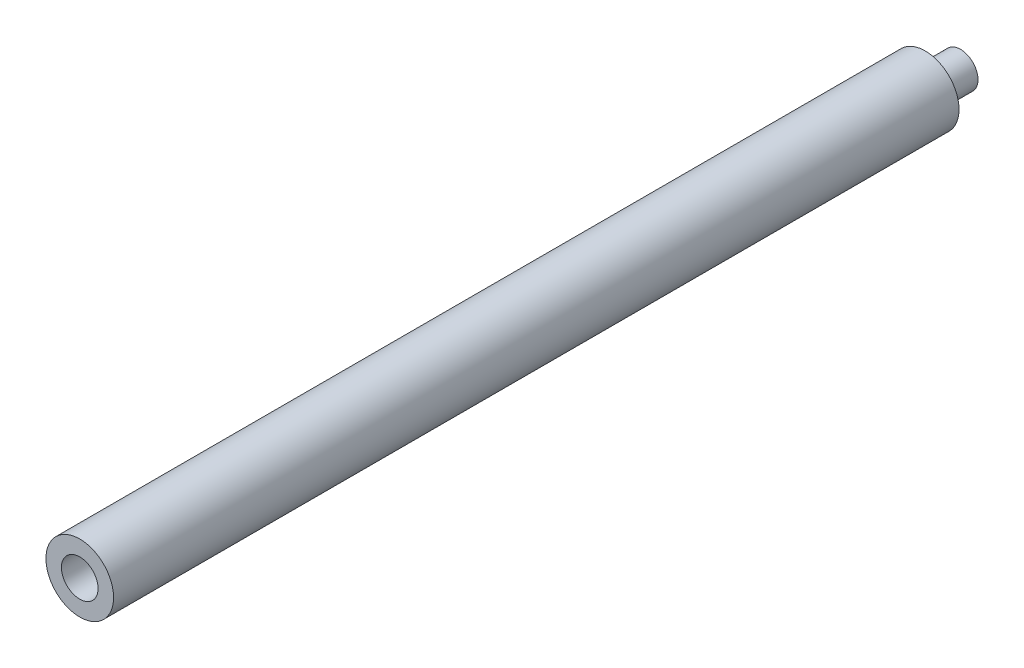
ISO-10303-21;
HEADER;
FILE_DESCRIPTION(('STEP AP214'),'2;1');
FILE_NAME('part.step','',(''),(''),'','','');
FILE_SCHEMA(('AUTOMOTIVE_DESIGN { 1 0 10303 214 1 1 1 1 }'));
ENDSEC;
DATA;
#1=APPLICATION_CONTEXT('core data for automotive mechanical design processes');
#2=APPLICATION_PROTOCOL_DEFINITION('international standard','automotive_design',2000,#1);
#3=PRODUCT_CONTEXT('',#1,'mechanical');
#4=PRODUCT('Part','Part','',(#3));
#5=PRODUCT_RELATED_PRODUCT_CATEGORY('part','',(#4));
#6=PRODUCT_DEFINITION_FORMATION('','',#4);
#7=PRODUCT_DEFINITION_CONTEXT('part definition',#1,'design');
#8=PRODUCT_DEFINITION('design','',#6,#7);
#9=PRODUCT_DEFINITION_SHAPE('','',#8);
#10=(LENGTH_UNIT() NAMED_UNIT(*) SI_UNIT(.MILLI.,.METRE.));
#11=(NAMED_UNIT(*) PLANE_ANGLE_UNIT() SI_UNIT($,.RADIAN.));
#12=(NAMED_UNIT(*) SI_UNIT($,.STERADIAN.) SOLID_ANGLE_UNIT());
#13=UNCERTAINTY_MEASURE_WITH_UNIT(LENGTH_MEASURE(1.E-05),#10,'distance_accuracy_value','');
#14=(GEOMETRIC_REPRESENTATION_CONTEXT(3) GLOBAL_UNCERTAINTY_ASSIGNED_CONTEXT((#13)) GLOBAL_UNIT_ASSIGNED_CONTEXT((#10,
#11,#12)) REPRESENTATION_CONTEXT('',''));
#15=CARTESIAN_POINT('',(0.,0.,0.));
#16=DIRECTION('',(0.,0.,1.));
#17=DIRECTION('',(1.,0.,0.));
#18=AXIS2_PLACEMENT_3D('',#15,#16,#17);
#19=CARTESIAN_POINT('',(0.,0.,60.));
#20=DIRECTION('',(0.,0.,-1.));
#21=DIRECTION('',(-1.,0.,0.));
#22=AXIS2_PLACEMENT_3D('',#19,#20,#21);
#23=CYLINDRICAL_SURFACE('',#22,2.4);
#24=CARTESIAN_POINT('',(0.,0.,60.));
#25=DIRECTION('',(0.,0.,1.));
#26=DIRECTION('',(1.,0.,0.));
#27=AXIS2_PLACEMENT_3D('',#24,#25,#26);
#28=CIRCLE('',#27,2.4);
#29=CARTESIAN_POINT('',(2.4,0.,60.));
#30=VERTEX_POINT('',#29);
#31=EDGE_CURVE('E45',#30,#30,#28,.T.);
#32=ORIENTED_EDGE('',*,*,#31,.F.);
#33=EDGE_LOOP('',(#32));
#34=FACE_BOUND('',#33,.T.);
#35=CARTESIAN_POINT('',(0.,0.,0.));
#36=DIRECTION('',(0.,0.,1.));
#37=DIRECTION('',(1.,0.,0.));
#38=AXIS2_PLACEMENT_3D('',#35,#36,#37);
#39=CIRCLE('',#38,2.4);
#40=CARTESIAN_POINT('',(2.4,0.,0.));
#41=VERTEX_POINT('',#40);
#42=EDGE_CURVE('E40',#41,#41,#39,.T.);
#43=ORIENTED_EDGE('',*,*,#42,.T.);
#44=EDGE_LOOP('',(#43));
#45=FACE_BOUND('',#44,.T.);
#46=ADVANCED_FACE('F37',(#34,#45),#23,.T.);
#47=CARTESIAN_POINT('',(0.,0.,60.));
#48=DIRECTION('',(0.,0.,1.));
#49=DIRECTION('',(1.,0.,0.));
#50=AXIS2_PLACEMENT_3D('',#47,#48,#49);
#51=PLANE('',#50);
#52=CARTESIAN_POINT('',(0.,0.,60.));
#53=DIRECTION('',(0.,0.,1.));
#54=DIRECTION('',(1.,0.,0.));
#55=AXIS2_PLACEMENT_3D('',#52,#53,#54);
#56=CIRCLE('',#55,1.3);
#57=CARTESIAN_POINT('',(1.3,0.,60.));
#58=VERTEX_POINT('',#57);
#59=EDGE_CURVE('E57',#58,#58,#56,.T.);
#60=ORIENTED_EDGE('',*,*,#59,.F.);
#61=EDGE_LOOP('',(#60));
#62=FACE_BOUND('',#61,.T.);
#63=ORIENTED_EDGE('',*,*,#31,.T.);
#64=EDGE_LOOP('',(#63));
#65=FACE_BOUND('',#64,.T.);
#66=ADVANCED_FACE('F74',(#62,#65),#51,.T.);
#67=CARTESIAN_POINT('',(0.,0.,0.));
#68=DIRECTION('',(0.,0.,1.));
#69=DIRECTION('',(1.,0.,0.));
#70=AXIS2_PLACEMENT_3D('',#67,#68,#69);
#71=PLANE('',#70);
#72=CARTESIAN_POINT('',(0.,0.,0.));
#73=DIRECTION('',(0.,0.,-1.));
#74=DIRECTION('',(-1.,0.,0.));
#75=AXIS2_PLACEMENT_3D('',#72,#73,#74);
#76=CIRCLE('',#75,1.25);
#77=CARTESIAN_POINT('',(-1.25,0.,0.));
#78=VERTEX_POINT('',#77);
#79=EDGE_CURVE('E10',#78,#78,#76,.T.);
#80=ORIENTED_EDGE('',*,*,#79,.F.);
#81=EDGE_LOOP('',(#80));
#82=FACE_BOUND('',#81,.T.);
#83=ORIENTED_EDGE('',*,*,#42,.F.);
#84=EDGE_LOOP('',(#83));
#85=FACE_BOUND('',#84,.T.);
#86=ADVANCED_FACE('F77',(#82,#85),#71,.F.);
#87=CARTESIAN_POINT('',(0.,0.,-2.5));
#88=DIRECTION('',(0.,0.,1.));
#89=DIRECTION('',(1.,0.,0.));
#90=AXIS2_PLACEMENT_3D('',#87,#88,#89);
#91=CYLINDRICAL_SURFACE('',#90,1.25);
#92=CARTESIAN_POINT('',(0.,0.,-2.5));
#93=DIRECTION('',(0.,0.,-1.));
#94=DIRECTION('',(-1.,0.,0.));
#95=AXIS2_PLACEMENT_3D('',#92,#93,#94);
#96=CIRCLE('',#95,1.25);
#97=CARTESIAN_POINT('',(-1.25,0.,-2.5));
#98=VERTEX_POINT('',#97);
#99=EDGE_CURVE('E52',#98,#98,#96,.T.);
#100=ORIENTED_EDGE('',*,*,#99,.F.);
#101=EDGE_LOOP('',(#100));
#102=FACE_BOUND('',#101,.T.);
#103=ORIENTED_EDGE('',*,*,#79,.T.);
#104=EDGE_LOOP('',(#103));
#105=FACE_BOUND('',#104,.T.);
#106=ADVANCED_FACE('F88',(#102,#105),#91,.T.);
#107=CARTESIAN_POINT('',(0.,0.,-2.5));
#108=DIRECTION('',(0.,0.,-1.));
#109=DIRECTION('',(-1.,0.,0.));
#110=AXIS2_PLACEMENT_3D('',#107,#108,#109);
#111=PLANE('',#110);
#112=ORIENTED_EDGE('',*,*,#99,.T.);
#113=EDGE_LOOP('',(#112));
#114=FACE_BOUND('',#113,.T.);
#115=ADVANCED_FACE('F70',(#114),#111,.T.);
#116=CARTESIAN_POINT('',(0.,0.,57.5));
#117=DIRECTION('',(0.,0.,1.));
#118=DIRECTION('',(1.,0.,0.));
#119=AXIS2_PLACEMENT_3D('',#116,#117,#118);
#120=CYLINDRICAL_SURFACE('',#119,1.3);
#121=CARTESIAN_POINT('',(0.,0.,57.5));
#122=DIRECTION('',(0.,0.,1.));
#123=DIRECTION('',(1.,0.,0.));
#124=AXIS2_PLACEMENT_3D('',#121,#122,#123);
#125=CIRCLE('',#124,1.3);
#126=CARTESIAN_POINT('',(1.3,0.,57.5));
#127=VERTEX_POINT('',#126);
#128=EDGE_CURVE('E56',#127,#127,#125,.T.);
#129=ORIENTED_EDGE('',*,*,#128,.F.);
#130=EDGE_LOOP('',(#129));
#131=FACE_BOUND('',#130,.T.);
#132=ORIENTED_EDGE('',*,*,#59,.T.);
#133=EDGE_LOOP('',(#132));
#134=FACE_BOUND('',#133,.T.);
#135=ADVANCED_FACE('F67',(#131,#134),#120,.F.);
#136=CARTESIAN_POINT('',(0.,0.,57.5));
#137=DIRECTION('',(0.,0.,1.));
#138=DIRECTION('',(1.,0.,0.));
#139=AXIS2_PLACEMENT_3D('',#136,#137,#138);
#140=PLANE('',#139);
#141=ORIENTED_EDGE('',*,*,#128,.T.);
#142=EDGE_LOOP('',(#141));
#143=FACE_BOUND('',#142,.T.);
#144=ADVANCED_FACE('F65',(#143),#140,.T.);
#145=CLOSED_SHELL('',(#46,#66,#86,#106,#115,#135,#144));
#146=MANIFOLD_SOLID_BREP('B2',#145);
#147=ADVANCED_BREP_SHAPE_REPRESENTATION('',(#18,#146),#14);
#148=SHAPE_DEFINITION_REPRESENTATION(#9,#147);
ENDSEC;
END-ISO-10303-21;
